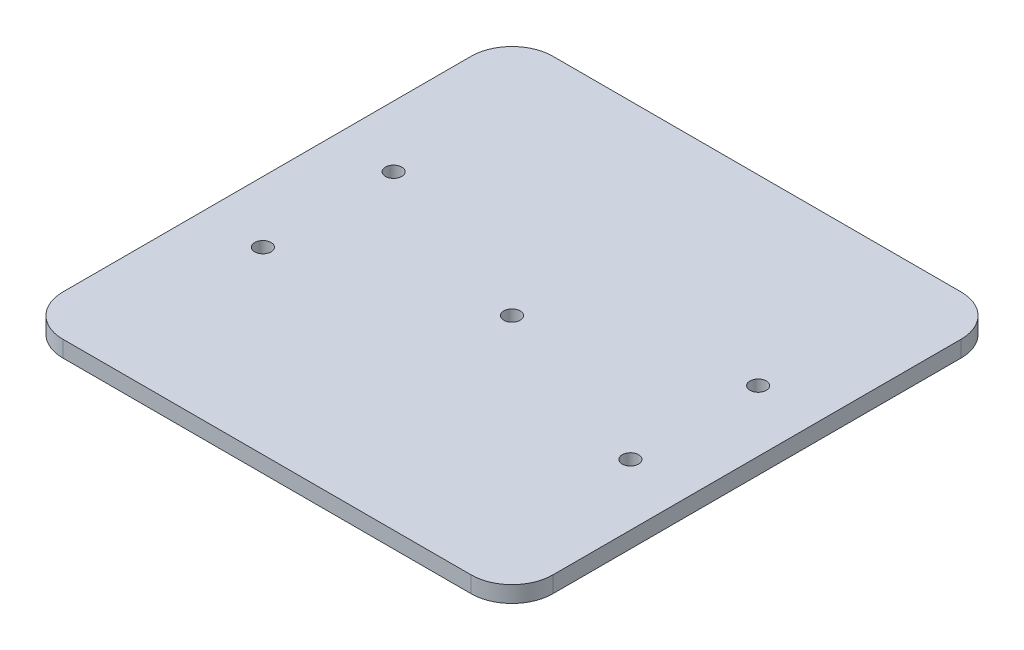
ISO-10303-21;
HEADER;
FILE_DESCRIPTION(('STEP AP214'),'2;1');
FILE_NAME('part.step','',(''),(''),'','','');
FILE_SCHEMA(('AUTOMOTIVE_DESIGN { 1 0 10303 214 1 1 1 1 }'));
ENDSEC;
DATA;
#1=APPLICATION_CONTEXT('core data for automotive mechanical design processes');
#2=APPLICATION_PROTOCOL_DEFINITION('international standard','automotive_design',2000,#1);
#3=PRODUCT_CONTEXT('',#1,'mechanical');
#4=PRODUCT('Part','Part','',(#3));
#5=PRODUCT_RELATED_PRODUCT_CATEGORY('part','',(#4));
#6=PRODUCT_DEFINITION_FORMATION('','',#4);
#7=PRODUCT_DEFINITION_CONTEXT('part definition',#1,'design');
#8=PRODUCT_DEFINITION('design','',#6,#7);
#9=PRODUCT_DEFINITION_SHAPE('','',#8);
#10=(LENGTH_UNIT() NAMED_UNIT(*) SI_UNIT(.MILLI.,.METRE.));
#11=(NAMED_UNIT(*) PLANE_ANGLE_UNIT() SI_UNIT($,.RADIAN.));
#12=(NAMED_UNIT(*) SI_UNIT($,.STERADIAN.) SOLID_ANGLE_UNIT());
#13=UNCERTAINTY_MEASURE_WITH_UNIT(LENGTH_MEASURE(1.E-05),#10,'distance_accuracy_value','');
#14=(GEOMETRIC_REPRESENTATION_CONTEXT(3) GLOBAL_UNCERTAINTY_ASSIGNED_CONTEXT((#13)) GLOBAL_UNIT_ASSIGNED_CONTEXT((#10,
#11,#12)) REPRESENTATION_CONTEXT('',''));
#15=CARTESIAN_POINT('',(0.,0.,0.));
#16=DIRECTION('',(0.,0.,1.));
#17=DIRECTION('',(1.,0.,0.));
#18=AXIS2_PLACEMENT_3D('',#15,#16,#17);
#19=CARTESIAN_POINT('',(24.7810218978102,2.,-23.029197080292));
#20=DIRECTION('',(0.,-1.,0.));
#21=DIRECTION('',(0.,0.,-1.));
#22=AXIS2_PLACEMENT_3D('',#19,#20,#21);
#23=CYLINDRICAL_SURFACE('',#22,5.);
#24=CARTESIAN_POINT('',(24.7810218978102,0.,-23.029197080292));
#25=DIRECTION('',(0.,1.,0.));
#26=DIRECTION('',(0.,0.,-1.));
#27=AXIS2_PLACEMENT_3D('',#24,#25,#26);
#28=CIRCLE('',#27,5.);
#29=CARTESIAN_POINT('',(29.7810218978102,0.,-23.0291970802919));
#30=VERTEX_POINT('',#29);
#31=CARTESIAN_POINT('',(24.7810218978101,0.,-28.029197080292));
#32=VERTEX_POINT('',#31);
#33=EDGE_CURVE('E146',#30,#32,#28,.T.);
#34=ORIENTED_EDGE('',*,*,#33,.T.);
#35=DIRECTION('',(0.,-1.,0.));
#36=VECTOR('',#35,1.);
#37=CARTESIAN_POINT('',(24.7810218978101,2.,-28.029197080292));
#38=LINE('',#37,#36);
#39=CARTESIAN_POINT('',(24.7810218978101,2.,-28.029197080292));
#40=VERTEX_POINT('',#39);
#41=EDGE_CURVE('E11',#40,#32,#38,.T.);
#42=ORIENTED_EDGE('',*,*,#41,.F.);
#43=CARTESIAN_POINT('',(24.7810218978102,2.,-23.029197080292));
#44=DIRECTION('',(0.,1.,0.));
#45=DIRECTION('',(0.,0.,-1.));
#46=AXIS2_PLACEMENT_3D('',#43,#44,#45);
#47=CIRCLE('',#46,5.);
#48=CARTESIAN_POINT('',(29.7810218978102,2.,-23.0291970802919));
#49=VERTEX_POINT('',#48);
#50=EDGE_CURVE('E168',#49,#40,#47,.T.);
#51=ORIENTED_EDGE('',*,*,#50,.F.);
#52=DIRECTION('',(0.,-1.,0.));
#53=VECTOR('',#52,1.);
#54=CARTESIAN_POINT('',(29.7810218978102,2.,-23.0291970802919));
#55=LINE('',#54,#53);
#56=EDGE_CURVE('E142',#49,#30,#55,.T.);
#57=ORIENTED_EDGE('',*,*,#56,.T.);
#58=EDGE_LOOP('',(#34,#42,#51,#57));
#59=FACE_BOUND('',#58,.T.);
#60=ADVANCED_FACE('F43',(#59),#23,.T.);
#61=CARTESIAN_POINT('',(-25.2189781021898,2.,-28.029197080292));
#62=DIRECTION('',(0.,0.,1.));
#63=DIRECTION('',(1.,0.,0.));
#64=AXIS2_PLACEMENT_3D('',#61,#62,#63);
#65=PLANE('',#64);
#66=DIRECTION('',(-1.,0.,0.));
#67=VECTOR('',#66,1.);
#68=CARTESIAN_POINT('',(-25.2189781021898,0.,-28.029197080292));
#69=LINE('',#68,#67);
#70=CARTESIAN_POINT('',(-25.2189781021898,0.,-28.029197080292));
#71=VERTEX_POINT('',#70);
#72=EDGE_CURVE('E150',#32,#71,#69,.T.);
#73=ORIENTED_EDGE('',*,*,#72,.T.);
#74=DIRECTION('',(0.,-1.,0.));
#75=VECTOR('',#74,1.);
#76=CARTESIAN_POINT('',(-25.2189781021898,2.,-28.029197080292));
#77=LINE('',#76,#75);
#78=CARTESIAN_POINT('',(-25.2189781021898,2.,-28.029197080292));
#79=VERTEX_POINT('',#78);
#80=EDGE_CURVE('E53',#79,#71,#77,.T.);
#81=ORIENTED_EDGE('',*,*,#80,.F.);
#82=DIRECTION('',(-1.,0.,0.));
#83=VECTOR('',#82,1.);
#84=CARTESIAN_POINT('',(-25.2189781021898,2.,-28.029197080292));
#85=LINE('',#84,#83);
#86=EDGE_CURVE('E105',#40,#79,#85,.T.);
#87=ORIENTED_EDGE('',*,*,#86,.F.);
#88=ORIENTED_EDGE('',*,*,#41,.T.);
#89=EDGE_LOOP('',(#73,#81,#87,#88));
#90=FACE_BOUND('',#89,.T.);
#91=ADVANCED_FACE('F238',(#90),#65,.F.);
#92=CARTESIAN_POINT('',(-25.2189781021898,2.,-23.029197080292));
#93=DIRECTION('',(0.,-1.,0.));
#94=DIRECTION('',(0.,0.,-1.));
#95=AXIS2_PLACEMENT_3D('',#92,#93,#94);
#96=CYLINDRICAL_SURFACE('',#95,5.);
#97=CARTESIAN_POINT('',(-25.2189781021898,0.,-23.029197080292));
#98=DIRECTION('',(0.,1.,0.));
#99=DIRECTION('',(0.,0.,1.));
#100=AXIS2_PLACEMENT_3D('',#97,#98,#99);
#101=CIRCLE('',#100,5.);
#102=CARTESIAN_POINT('',(-30.2189781021898,0.,-23.0291970802919));
#103=VERTEX_POINT('',#102);
#104=EDGE_CURVE('E153',#71,#103,#101,.T.);
#105=ORIENTED_EDGE('',*,*,#104,.T.);
#106=DIRECTION('',(0.,-1.,0.));
#107=VECTOR('',#106,1.);
#108=CARTESIAN_POINT('',(-30.2189781021898,2.,-23.0291970802919));
#109=LINE('',#108,#107);
#110=CARTESIAN_POINT('',(-30.2189781021898,2.,-23.0291970802919));
#111=VERTEX_POINT('',#110);
#112=EDGE_CURVE('E179',#111,#103,#109,.T.);
#113=ORIENTED_EDGE('',*,*,#112,.F.);
#114=CARTESIAN_POINT('',(-25.2189781021898,2.,-23.029197080292));
#115=DIRECTION('',(0.,1.,0.));
#116=DIRECTION('',(0.,0.,1.));
#117=AXIS2_PLACEMENT_3D('',#114,#115,#116);
#118=CIRCLE('',#117,5.);
#119=EDGE_CURVE('E413',#79,#111,#118,.T.);
#120=ORIENTED_EDGE('',*,*,#119,.F.);
#121=ORIENTED_EDGE('',*,*,#80,.T.);
#122=EDGE_LOOP('',(#105,#113,#120,#121));
#123=FACE_BOUND('',#122,.T.);
#124=ADVANCED_FACE('F242',(#123),#96,.T.);
#125=CARTESIAN_POINT('',(-30.2189781021898,2.,-23.0291970802919));
#126=DIRECTION('',(1.,0.,0.));
#127=DIRECTION('',(0.,0.,-1.));
#128=AXIS2_PLACEMENT_3D('',#125,#126,#127);
#129=PLANE('',#128);
#130=DIRECTION('',(0.,0.,1.));
#131=VECTOR('',#130,1.);
#132=CARTESIAN_POINT('',(-30.2189781021898,0.,-23.0291970802919));
#133=LINE('',#132,#131);
#134=CARTESIAN_POINT('',(-30.2189781021898,0.,26.970802919708));
#135=VERTEX_POINT('',#134);
#136=EDGE_CURVE('E156',#103,#135,#133,.T.);
#137=ORIENTED_EDGE('',*,*,#136,.T.);
#138=DIRECTION('',(0.,-1.,0.));
#139=VECTOR('',#138,1.);
#140=CARTESIAN_POINT('',(-30.2189781021898,2.,26.970802919708));
#141=LINE('',#140,#139);
#142=CARTESIAN_POINT('',(-30.2189781021898,2.,26.970802919708));
#143=VERTEX_POINT('',#142);
#144=EDGE_CURVE('E175',#143,#135,#141,.T.);
#145=ORIENTED_EDGE('',*,*,#144,.F.);
#146=DIRECTION('',(0.,0.,1.));
#147=VECTOR('',#146,1.);
#148=CARTESIAN_POINT('',(-30.2189781021898,2.,-23.0291970802919));
#149=LINE('',#148,#147);
#150=EDGE_CURVE('E416',#111,#143,#149,.T.);
#151=ORIENTED_EDGE('',*,*,#150,.F.);
#152=ORIENTED_EDGE('',*,*,#112,.T.);
#153=EDGE_LOOP('',(#137,#145,#151,#152));
#154=FACE_BOUND('',#153,.T.);
#155=ADVANCED_FACE('F246',(#154),#129,.F.);
#156=CARTESIAN_POINT('',(-25.2189781021898,2.,26.970802919708));
#157=DIRECTION('',(0.,-1.,0.));
#158=DIRECTION('',(0.,0.,-1.));
#159=AXIS2_PLACEMENT_3D('',#156,#157,#158);
#160=CYLINDRICAL_SURFACE('',#159,5.);
#161=CARTESIAN_POINT('',(-25.2189781021898,0.,26.970802919708));
#162=DIRECTION('',(0.,1.,0.));
#163=DIRECTION('',(0.,0.,1.));
#164=AXIS2_PLACEMENT_3D('',#161,#162,#163);
#165=CIRCLE('',#164,5.);
#166=CARTESIAN_POINT('',(-25.2189781021898,0.,31.970802919708));
#167=VERTEX_POINT('',#166);
#168=EDGE_CURVE('E159',#135,#167,#165,.T.);
#169=ORIENTED_EDGE('',*,*,#168,.T.);
#170=DIRECTION('',(0.,-1.,0.));
#171=VECTOR('',#170,1.);
#172=CARTESIAN_POINT('',(-25.2189781021898,2.,31.970802919708));
#173=LINE('',#172,#171);
#174=CARTESIAN_POINT('',(-25.2189781021898,2.,31.970802919708));
#175=VERTEX_POINT('',#174);
#176=EDGE_CURVE('E135',#175,#167,#173,.T.);
#177=ORIENTED_EDGE('',*,*,#176,.F.);
#178=CARTESIAN_POINT('',(-25.2189781021898,2.,26.970802919708));
#179=DIRECTION('',(0.,1.,0.));
#180=DIRECTION('',(0.,0.,1.));
#181=AXIS2_PLACEMENT_3D('',#178,#179,#180);
#182=CIRCLE('',#181,5.);
#183=EDGE_CURVE('E124',#143,#175,#182,.T.);
#184=ORIENTED_EDGE('',*,*,#183,.F.);
#185=ORIENTED_EDGE('',*,*,#144,.T.);
#186=EDGE_LOOP('',(#169,#177,#184,#185));
#187=FACE_BOUND('',#186,.T.);
#188=ADVANCED_FACE('F252',(#187),#160,.T.);
#189=CARTESIAN_POINT('',(-25.2189781021898,2.,31.970802919708));
#190=DIRECTION('',(0.,0.,-1.));
#191=DIRECTION('',(-1.,0.,0.));
#192=AXIS2_PLACEMENT_3D('',#189,#190,#191);
#193=PLANE('',#192);
#194=DIRECTION('',(1.,0.,0.));
#195=VECTOR('',#194,1.);
#196=CARTESIAN_POINT('',(-25.2189781021898,0.,31.970802919708));
#197=LINE('',#196,#195);
#198=CARTESIAN_POINT('',(24.7810218978102,0.,31.970802919708));
#199=VERTEX_POINT('',#198);
#200=EDGE_CURVE('E133',#167,#199,#197,.T.);
#201=ORIENTED_EDGE('',*,*,#200,.T.);
#202=DIRECTION('',(0.,-1.,0.));
#203=VECTOR('',#202,1.);
#204=CARTESIAN_POINT('',(24.7810218978102,2.,31.970802919708));
#205=LINE('',#204,#203);
#206=CARTESIAN_POINT('',(24.7810218978102,2.,31.970802919708));
#207=VERTEX_POINT('',#206);
#208=EDGE_CURVE('E130',#207,#199,#205,.T.);
#209=ORIENTED_EDGE('',*,*,#208,.F.);
#210=DIRECTION('',(1.,0.,0.));
#211=VECTOR('',#210,1.);
#212=CARTESIAN_POINT('',(-25.2189781021898,2.,31.970802919708));
#213=LINE('',#212,#211);
#214=EDGE_CURVE('E118',#175,#207,#213,.T.);
#215=ORIENTED_EDGE('',*,*,#214,.F.);
#216=ORIENTED_EDGE('',*,*,#176,.T.);
#217=EDGE_LOOP('',(#201,#209,#215,#216));
#218=FACE_BOUND('',#217,.T.);
#219=ADVANCED_FACE('F131',(#218),#193,.F.);
#220=CARTESIAN_POINT('',(24.7810218978102,2.,26.970802919708));
#221=DIRECTION('',(0.,-1.,0.));
#222=DIRECTION('',(0.,0.,-1.));
#223=AXIS2_PLACEMENT_3D('',#220,#221,#222);
#224=CYLINDRICAL_SURFACE('',#223,5.);
#225=CARTESIAN_POINT('',(24.7810218978102,0.,26.970802919708));
#226=DIRECTION('',(0.,1.,0.));
#227=DIRECTION('',(0.,0.,1.));
#228=AXIS2_PLACEMENT_3D('',#225,#226,#227);
#229=CIRCLE('',#228,5.);
#230=CARTESIAN_POINT('',(29.7810218978102,0.,26.970802919708));
#231=VERTEX_POINT('',#230);
#232=EDGE_CURVE('E91',#199,#231,#229,.T.);
#233=ORIENTED_EDGE('',*,*,#232,.T.);
#234=DIRECTION('',(0.,-1.,0.));
#235=VECTOR('',#234,1.);
#236=CARTESIAN_POINT('',(29.7810218978102,2.,26.970802919708));
#237=LINE('',#236,#235);
#238=CARTESIAN_POINT('',(29.7810218978102,2.,26.970802919708));
#239=VERTEX_POINT('',#238);
#240=EDGE_CURVE('E136',#239,#231,#237,.T.);
#241=ORIENTED_EDGE('',*,*,#240,.F.);
#242=CARTESIAN_POINT('',(24.7810218978102,2.,26.970802919708));
#243=DIRECTION('',(0.,1.,0.));
#244=DIRECTION('',(0.,0.,1.));
#245=AXIS2_PLACEMENT_3D('',#242,#243,#244);
#246=CIRCLE('',#245,5.);
#247=EDGE_CURVE('E122',#207,#239,#246,.T.);
#248=ORIENTED_EDGE('',*,*,#247,.F.);
#249=ORIENTED_EDGE('',*,*,#208,.T.);
#250=EDGE_LOOP('',(#233,#241,#248,#249));
#251=FACE_BOUND('',#250,.T.);
#252=ADVANCED_FACE('F138',(#251),#224,.T.);
#253=CARTESIAN_POINT('',(29.7810218978102,2.,-23.0291970802919));
#254=DIRECTION('',(-1.,0.,0.));
#255=DIRECTION('',(0.,0.,1.));
#256=AXIS2_PLACEMENT_3D('',#253,#254,#255);
#257=PLANE('',#256);
#258=DIRECTION('',(0.,0.,-1.));
#259=VECTOR('',#258,1.);
#260=CARTESIAN_POINT('',(29.7810218978102,0.,-23.0291970802919));
#261=LINE('',#260,#259);
#262=EDGE_CURVE('E97',#231,#30,#261,.T.);
#263=ORIENTED_EDGE('',*,*,#262,.T.);
#264=ORIENTED_EDGE('',*,*,#56,.F.);
#265=DIRECTION('',(0.,0.,-1.));
#266=VECTOR('',#265,1.);
#267=CARTESIAN_POINT('',(29.7810218978102,2.,-23.0291970802919));
#268=LINE('',#267,#266);
#269=EDGE_CURVE('E62',#239,#49,#268,.T.);
#270=ORIENTED_EDGE('',*,*,#269,.F.);
#271=ORIENTED_EDGE('',*,*,#240,.T.);
#272=EDGE_LOOP('',(#263,#264,#270,#271));
#273=FACE_BOUND('',#272,.T.);
#274=ADVANCED_FACE('F227',(#273),#257,.F.);
#275=CARTESIAN_POINT('',(24.7810218978102,2.,-23.029197080292));
#276=DIRECTION('',(0.,-1.,0.));
#277=DIRECTION('',(0.,0.,-1.));
#278=AXIS2_PLACEMENT_3D('',#275,#276,#277);
#279=PLANE('',#278);
#280=CARTESIAN_POINT('',(-22.7189781021898,2.,9.97080291970804));
#281=DIRECTION('',(0.,1.,0.));
#282=DIRECTION('',(0.,0.,1.));
#283=AXIS2_PLACEMENT_3D('',#280,#281,#282);
#284=CIRCLE('',#283,1.);
#285=CARTESIAN_POINT('',(-22.7189781021898,2.,10.970802919708));
#286=VERTEX_POINT('',#285);
#287=EDGE_CURVE('E394',#286,#286,#284,.T.);
#288=ORIENTED_EDGE('',*,*,#287,.F.);
#289=EDGE_LOOP('',(#288));
#290=FACE_BOUND('',#289,.T.);
#291=CARTESIAN_POINT('',(22.2810218978102,2.,-5.6698952391374));
#292=DIRECTION('',(0.,1.,0.));
#293=DIRECTION('',(0.,0.,1.));
#294=AXIS2_PLACEMENT_3D('',#291,#292,#293);
#295=CIRCLE('',#294,1.);
#296=CARTESIAN_POINT('',(22.2810218978102,2.,-4.6698952391374));
#297=VERTEX_POINT('',#296);
#298=EDGE_CURVE('E391',#297,#297,#295,.T.);
#299=ORIENTED_EDGE('',*,*,#298,.F.);
#300=EDGE_LOOP('',(#299));
#301=FACE_BOUND('',#300,.T.);
#302=CARTESIAN_POINT('',(22.2810218978102,2.,9.97080291970804));
#303=DIRECTION('',(0.,1.,0.));
#304=DIRECTION('',(0.,0.,1.));
#305=AXIS2_PLACEMENT_3D('',#302,#303,#304);
#306=CIRCLE('',#305,1.);
#307=CARTESIAN_POINT('',(22.2810218978102,2.,10.970802919708));
#308=VERTEX_POINT('',#307);
#309=EDGE_CURVE('E395',#308,#308,#306,.T.);
#310=ORIENTED_EDGE('',*,*,#309,.F.);
#311=EDGE_LOOP('',(#310));
#312=FACE_BOUND('',#311,.T.);
#313=CARTESIAN_POINT('',(-0.2189781021898,2.,1.97080291970804));
#314=DIRECTION('',(0.,1.,0.));
#315=DIRECTION('',(0.,0.,1.));
#316=AXIS2_PLACEMENT_3D('',#313,#314,#315);
#317=CIRCLE('',#316,1.);
#318=CARTESIAN_POINT('',(-0.2189781021898,2.,2.97080291970804));
#319=VERTEX_POINT('',#318);
#320=EDGE_CURVE('E402',#319,#319,#317,.T.);
#321=ORIENTED_EDGE('',*,*,#320,.F.);
#322=EDGE_LOOP('',(#321));
#323=FACE_BOUND('',#322,.T.);
#324=CARTESIAN_POINT('',(-22.7189781021898,2.,-6.02919708029195));
#325=DIRECTION('',(0.,1.,0.));
#326=DIRECTION('',(0.,0.,1.));
#327=AXIS2_PLACEMENT_3D('',#324,#325,#326);
#328=CIRCLE('',#327,1.);
#329=CARTESIAN_POINT('',(-22.7189781021898,2.,-5.02919708029195));
#330=VERTEX_POINT('',#329);
#331=EDGE_CURVE('E191',#330,#330,#328,.T.);
#332=ORIENTED_EDGE('',*,*,#331,.F.);
#333=EDGE_LOOP('',(#332));
#334=FACE_BOUND('',#333,.T.);
#335=ORIENTED_EDGE('',*,*,#50,.T.);
#336=ORIENTED_EDGE('',*,*,#86,.T.);
#337=ORIENTED_EDGE('',*,*,#119,.T.);
#338=ORIENTED_EDGE('',*,*,#150,.T.);
#339=ORIENTED_EDGE('',*,*,#183,.T.);
#340=ORIENTED_EDGE('',*,*,#214,.T.);
#341=ORIENTED_EDGE('',*,*,#247,.T.);
#342=ORIENTED_EDGE('',*,*,#269,.T.);
#343=EDGE_LOOP('',(#335,#336,#337,#338,#339,#340,#341,#342));
#344=FACE_BOUND('',#343,.T.);
#345=ADVANCED_FACE('F120',(#290,#301,#312,#323,#334,#344),#279,.F.);
#346=CARTESIAN_POINT('',(24.7810218978102,0.,-23.029197080292));
#347=DIRECTION('',(0.,-1.,0.));
#348=DIRECTION('',(0.,0.,-1.));
#349=AXIS2_PLACEMENT_3D('',#346,#347,#348);
#350=PLANE('',#349);
#351=CARTESIAN_POINT('',(-22.7189781021898,0.,9.97080291970804));
#352=DIRECTION('',(0.,-1.,0.));
#353=DIRECTION('',(0.,0.,-1.));
#354=AXIS2_PLACEMENT_3D('',#351,#352,#353);
#355=CIRCLE('',#354,1.);
#356=CARTESIAN_POINT('',(-22.7189781021898,0.,8.97080291970804));
#357=VERTEX_POINT('',#356);
#358=EDGE_CURVE('E46',#357,#357,#355,.T.);
#359=ORIENTED_EDGE('',*,*,#358,.F.);
#360=EDGE_LOOP('',(#359));
#361=FACE_BOUND('',#360,.T.);
#362=CARTESIAN_POINT('',(22.2810218978102,0.,-5.6698952391374));
#363=DIRECTION('',(0.,-1.,0.));
#364=DIRECTION('',(0.,0.,-1.));
#365=AXIS2_PLACEMENT_3D('',#362,#363,#364);
#366=CIRCLE('',#365,1.);
#367=CARTESIAN_POINT('',(22.2810218978102,0.,-6.6698952391374));
#368=VERTEX_POINT('',#367);
#369=EDGE_CURVE('E198',#368,#368,#366,.T.);
#370=ORIENTED_EDGE('',*,*,#369,.F.);
#371=EDGE_LOOP('',(#370));
#372=FACE_BOUND('',#371,.T.);
#373=CARTESIAN_POINT('',(22.2810218978102,0.,9.97080291970804));
#374=DIRECTION('',(0.,-1.,0.));
#375=DIRECTION('',(0.,0.,-1.));
#376=AXIS2_PLACEMENT_3D('',#373,#374,#375);
#377=CIRCLE('',#376,1.);
#378=CARTESIAN_POINT('',(22.2810218978102,0.,8.97080291970804));
#379=VERTEX_POINT('',#378);
#380=EDGE_CURVE('E195',#379,#379,#377,.T.);
#381=ORIENTED_EDGE('',*,*,#380,.F.);
#382=EDGE_LOOP('',(#381));
#383=FACE_BOUND('',#382,.T.);
#384=CARTESIAN_POINT('',(-0.2189781021898,0.,1.97080291970804));
#385=DIRECTION('',(0.,-1.,0.));
#386=DIRECTION('',(0.,0.,-1.));
#387=AXIS2_PLACEMENT_3D('',#384,#385,#386);
#388=CIRCLE('',#387,1.);
#389=CARTESIAN_POINT('',(-0.2189781021898,0.,0.970802919708038));
#390=VERTEX_POINT('',#389);
#391=EDGE_CURVE('E190',#390,#390,#388,.T.);
#392=ORIENTED_EDGE('',*,*,#391,.F.);
#393=EDGE_LOOP('',(#392));
#394=FACE_BOUND('',#393,.T.);
#395=CARTESIAN_POINT('',(-22.7189781021898,0.,-6.02919708029195));
#396=DIRECTION('',(0.,-1.,0.));
#397=DIRECTION('',(0.,0.,-1.));
#398=AXIS2_PLACEMENT_3D('',#395,#396,#397);
#399=CIRCLE('',#398,1.);
#400=CARTESIAN_POINT('',(-22.7189781021898,0.,-7.02919708029195));
#401=VERTEX_POINT('',#400);
#402=EDGE_CURVE('E186',#401,#401,#399,.T.);
#403=ORIENTED_EDGE('',*,*,#402,.F.);
#404=EDGE_LOOP('',(#403));
#405=FACE_BOUND('',#404,.T.);
#406=ORIENTED_EDGE('',*,*,#33,.F.);
#407=ORIENTED_EDGE('',*,*,#262,.F.);
#408=ORIENTED_EDGE('',*,*,#232,.F.);
#409=ORIENTED_EDGE('',*,*,#200,.F.);
#410=ORIENTED_EDGE('',*,*,#168,.F.);
#411=ORIENTED_EDGE('',*,*,#136,.F.);
#412=ORIENTED_EDGE('',*,*,#104,.F.);
#413=ORIENTED_EDGE('',*,*,#72,.F.);
#414=EDGE_LOOP('',(#406,#407,#408,#409,#410,#411,#412,#413));
#415=FACE_BOUND('',#414,.T.);
#416=ADVANCED_FACE('F210',(#361,#372,#383,#394,#405,#415),#350,.T.);
#417=CARTESIAN_POINT('',(-22.7189781021898,-1.,-6.02919708029195));
#418=DIRECTION('',(0.,1.,0.));
#419=DIRECTION('',(0.,0.,1.));
#420=AXIS2_PLACEMENT_3D('',#417,#418,#419);
#421=CYLINDRICAL_SURFACE('',#420,1.);
#422=ORIENTED_EDGE('',*,*,#402,.T.);
#423=EDGE_LOOP('',(#422));
#424=FACE_BOUND('',#423,.T.);
#425=ORIENTED_EDGE('',*,*,#331,.T.);
#426=EDGE_LOOP('',(#425));
#427=FACE_BOUND('',#426,.T.);
#428=ADVANCED_FACE('F213',(#424,#427),#421,.F.);
#429=CARTESIAN_POINT('',(-0.2189781021898,-1.,1.97080291970804));
#430=DIRECTION('',(0.,1.,0.));
#431=DIRECTION('',(0.,0.,1.));
#432=AXIS2_PLACEMENT_3D('',#429,#430,#431);
#433=CYLINDRICAL_SURFACE('',#432,1.);
#434=ORIENTED_EDGE('',*,*,#391,.T.);
#435=EDGE_LOOP('',(#434));
#436=FACE_BOUND('',#435,.T.);
#437=ORIENTED_EDGE('',*,*,#320,.T.);
#438=EDGE_LOOP('',(#437));
#439=FACE_BOUND('',#438,.T.);
#440=ADVANCED_FACE('F295',(#436,#439),#433,.F.);
#441=CARTESIAN_POINT('',(22.2810218978102,-1.,9.97080291970804));
#442=DIRECTION('',(0.,1.,0.));
#443=DIRECTION('',(0.,0.,1.));
#444=AXIS2_PLACEMENT_3D('',#441,#442,#443);
#445=CYLINDRICAL_SURFACE('',#444,1.);
#446=ORIENTED_EDGE('',*,*,#380,.T.);
#447=EDGE_LOOP('',(#446));
#448=FACE_BOUND('',#447,.T.);
#449=ORIENTED_EDGE('',*,*,#309,.T.);
#450=EDGE_LOOP('',(#449));
#451=FACE_BOUND('',#450,.T.);
#452=ADVANCED_FACE('F306',(#448,#451),#445,.F.);
#453=CARTESIAN_POINT('',(22.2810218978102,-1.,-5.6698952391374));
#454=DIRECTION('',(0.,1.,0.));
#455=DIRECTION('',(0.,0.,1.));
#456=AXIS2_PLACEMENT_3D('',#453,#454,#455);
#457=CYLINDRICAL_SURFACE('',#456,1.);
#458=ORIENTED_EDGE('',*,*,#369,.T.);
#459=EDGE_LOOP('',(#458));
#460=FACE_BOUND('',#459,.T.);
#461=ORIENTED_EDGE('',*,*,#298,.T.);
#462=EDGE_LOOP('',(#461));
#463=FACE_BOUND('',#462,.T.);
#464=ADVANCED_FACE('F317',(#460,#463),#457,.F.);
#465=CARTESIAN_POINT('',(-22.7189781021898,-1.,9.97080291970804));
#466=DIRECTION('',(0.,1.,0.));
#467=DIRECTION('',(0.,0.,1.));
#468=AXIS2_PLACEMENT_3D('',#465,#466,#467);
#469=CYLINDRICAL_SURFACE('',#468,1.);
#470=ORIENTED_EDGE('',*,*,#358,.T.);
#471=EDGE_LOOP('',(#470));
#472=FACE_BOUND('',#471,.T.);
#473=ORIENTED_EDGE('',*,*,#287,.T.);
#474=EDGE_LOOP('',(#473));
#475=FACE_BOUND('',#474,.T.);
#476=ADVANCED_FACE('F207',(#472,#475),#469,.F.);
#477=CLOSED_SHELL('',(#60,#91,#124,#155,#188,#219,#252,#274,#345,#416,#428,#440,#452,#464,#476));
#478=MANIFOLD_SOLID_BREP('B2',#477);
#479=ADVANCED_BREP_SHAPE_REPRESENTATION('',(#18,#478),#14);
#480=SHAPE_DEFINITION_REPRESENTATION(#9,#479);
ENDSEC;
END-ISO-10303-21;
